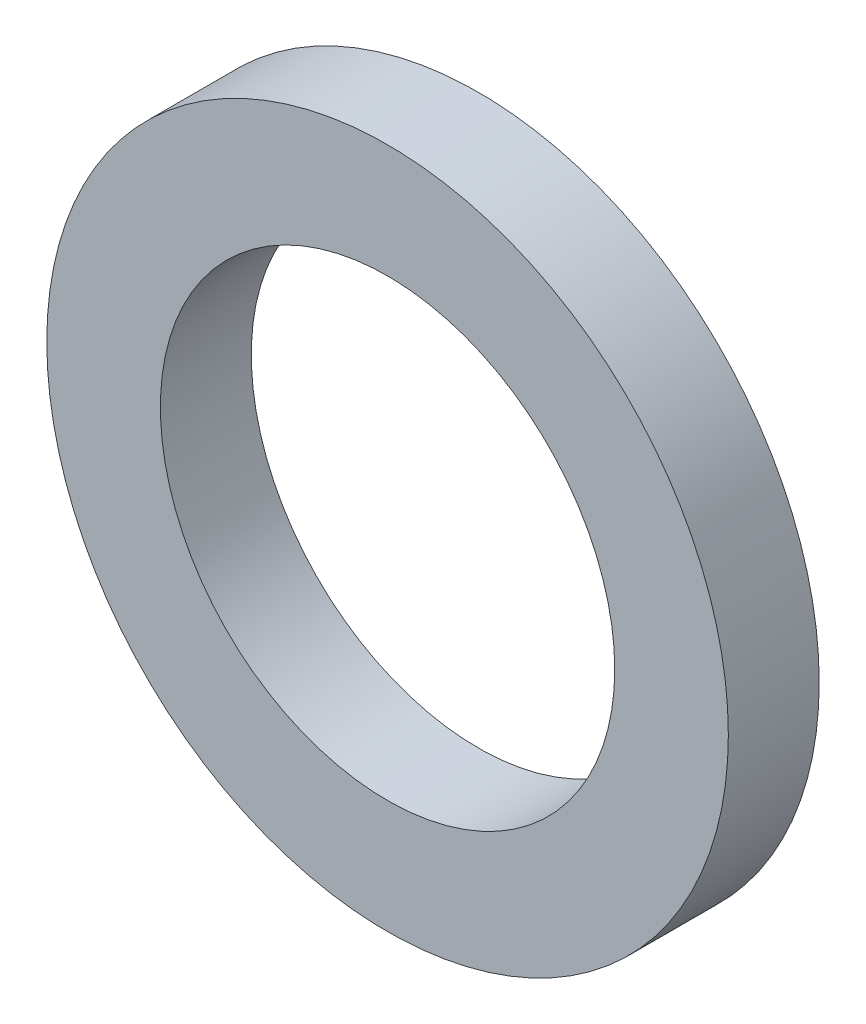
ISO-10303-21;
HEADER;
FILE_DESCRIPTION(('STEP AP214'),'2;1');
FILE_NAME('part.step','',(''),(''),'','','');
FILE_SCHEMA(('AUTOMOTIVE_DESIGN { 1 0 10303 214 1 1 1 1 }'));
ENDSEC;
DATA;
#1=APPLICATION_CONTEXT('core data for automotive mechanical design processes');
#2=APPLICATION_PROTOCOL_DEFINITION('international standard','automotive_design',2000,#1);
#3=PRODUCT_CONTEXT('',#1,'mechanical');
#4=PRODUCT('Part','Part','',(#3));
#5=PRODUCT_RELATED_PRODUCT_CATEGORY('part','',(#4));
#6=PRODUCT_DEFINITION_FORMATION('','',#4);
#7=PRODUCT_DEFINITION_CONTEXT('part definition',#1,'design');
#8=PRODUCT_DEFINITION('design','',#6,#7);
#9=PRODUCT_DEFINITION_SHAPE('','',#8);
#10=(LENGTH_UNIT() NAMED_UNIT(*) SI_UNIT(.MILLI.,.METRE.));
#11=(NAMED_UNIT(*) PLANE_ANGLE_UNIT() SI_UNIT($,.RADIAN.));
#12=(NAMED_UNIT(*) SI_UNIT($,.STERADIAN.) SOLID_ANGLE_UNIT());
#13=UNCERTAINTY_MEASURE_WITH_UNIT(LENGTH_MEASURE(1.E-05),#10,'distance_accuracy_value','');
#14=(GEOMETRIC_REPRESENTATION_CONTEXT(3) GLOBAL_UNCERTAINTY_ASSIGNED_CONTEXT((#13)) GLOBAL_UNIT_ASSIGNED_CONTEXT((#10,
#11,#12)) REPRESENTATION_CONTEXT('',''));
#15=CARTESIAN_POINT('',(0.,0.,0.));
#16=DIRECTION('',(0.,0.,1.));
#17=DIRECTION('',(1.,0.,0.));
#18=AXIS2_PLACEMENT_3D('',#15,#16,#17);
#19=CARTESIAN_POINT('',(0.,0.,2.));
#20=DIRECTION('',(0.,0.,1.));
#21=DIRECTION('',(1.,0.,0.));
#22=AXIS2_PLACEMENT_3D('',#19,#20,#21);
#23=PLANE('',#22);
#24=CARTESIAN_POINT('',(0.,0.,2.));
#25=DIRECTION('',(0.,0.,1.));
#26=DIRECTION('',(1.,0.,0.));
#27=AXIS2_PLACEMENT_3D('',#24,#25,#26);
#28=CIRCLE('',#27,7.5);
#29=CARTESIAN_POINT('',(7.5,0.,2.));
#30=VERTEX_POINT('',#29);
#31=EDGE_CURVE('E10',#30,#30,#28,.T.);
#32=ORIENTED_EDGE('',*,*,#31,.T.);
#33=EDGE_LOOP('',(#32));
#34=FACE_BOUND('',#33,.T.);
#35=CARTESIAN_POINT('',(0.,0.,2.));
#36=DIRECTION('',(0.,0.,1.));
#37=DIRECTION('',(1.,0.,0.));
#38=AXIS2_PLACEMENT_3D('',#35,#36,#37);
#39=CIRCLE('',#38,5.);
#40=CARTESIAN_POINT('',(5.,0.,2.));
#41=VERTEX_POINT('',#40);
#42=EDGE_CURVE('E50',#41,#41,#39,.T.);
#43=ORIENTED_EDGE('',*,*,#42,.F.);
#44=EDGE_LOOP('',(#43));
#45=FACE_BOUND('',#44,.T.);
#46=ADVANCED_FACE('F37',(#34,#45),#23,.T.);
#47=CARTESIAN_POINT('',(0.,0.,0.));
#48=DIRECTION('',(0.,0.,1.));
#49=DIRECTION('',(1.,0.,0.));
#50=AXIS2_PLACEMENT_3D('',#47,#48,#49);
#51=PLANE('',#50);
#52=CARTESIAN_POINT('',(0.,0.,0.));
#53=DIRECTION('',(0.,0.,1.));
#54=DIRECTION('',(1.,0.,0.));
#55=AXIS2_PLACEMENT_3D('',#52,#53,#54);
#56=CIRCLE('',#55,7.5);
#57=CARTESIAN_POINT('',(7.5,0.,0.));
#58=VERTEX_POINT('',#57);
#59=EDGE_CURVE('E41',#58,#58,#56,.T.);
#60=ORIENTED_EDGE('',*,*,#59,.F.);
#61=EDGE_LOOP('',(#60));
#62=FACE_BOUND('',#61,.T.);
#63=CARTESIAN_POINT('',(0.,0.,0.));
#64=DIRECTION('',(0.,0.,1.));
#65=DIRECTION('',(1.,0.,0.));
#66=AXIS2_PLACEMENT_3D('',#63,#64,#65);
#67=CIRCLE('',#66,5.);
#68=CARTESIAN_POINT('',(5.,0.,0.));
#69=VERTEX_POINT('',#68);
#70=EDGE_CURVE('E52',#69,#69,#67,.T.);
#71=ORIENTED_EDGE('',*,*,#70,.T.);
#72=EDGE_LOOP('',(#71));
#73=FACE_BOUND('',#72,.T.);
#74=ADVANCED_FACE('F64',(#62,#73),#51,.F.);
#75=CARTESIAN_POINT('',(0.,0.,2.));
#76=DIRECTION('',(0.,0.,-1.));
#77=DIRECTION('',(-1.,0.,0.));
#78=AXIS2_PLACEMENT_3D('',#75,#76,#77);
#79=CYLINDRICAL_SURFACE('',#78,7.5);
#80=ORIENTED_EDGE('',*,*,#31,.F.);
#81=EDGE_LOOP('',(#80));
#82=FACE_BOUND('',#81,.T.);
#83=ORIENTED_EDGE('',*,*,#59,.T.);
#84=EDGE_LOOP('',(#83));
#85=FACE_BOUND('',#84,.T.);
#86=ADVANCED_FACE('F39',(#82,#85),#79,.T.);
#87=CARTESIAN_POINT('',(0.,0.,2.));
#88=DIRECTION('',(0.,0.,-1.));
#89=DIRECTION('',(-1.,0.,0.));
#90=AXIS2_PLACEMENT_3D('',#87,#88,#89);
#91=CYLINDRICAL_SURFACE('',#90,5.);
#92=ORIENTED_EDGE('',*,*,#42,.T.);
#93=EDGE_LOOP('',(#92));
#94=FACE_BOUND('',#93,.T.);
#95=ORIENTED_EDGE('',*,*,#70,.F.);
#96=EDGE_LOOP('',(#95));
#97=FACE_BOUND('',#96,.T.);
#98=ADVANCED_FACE('F60',(#94,#97),#91,.F.);
#99=CLOSED_SHELL('',(#46,#74,#86,#98));
#100=MANIFOLD_SOLID_BREP('B2',#99);
#101=ADVANCED_BREP_SHAPE_REPRESENTATION('',(#18,#100),#14);
#102=SHAPE_DEFINITION_REPRESENTATION(#9,#101);
ENDSEC;
END-ISO-10303-21;
